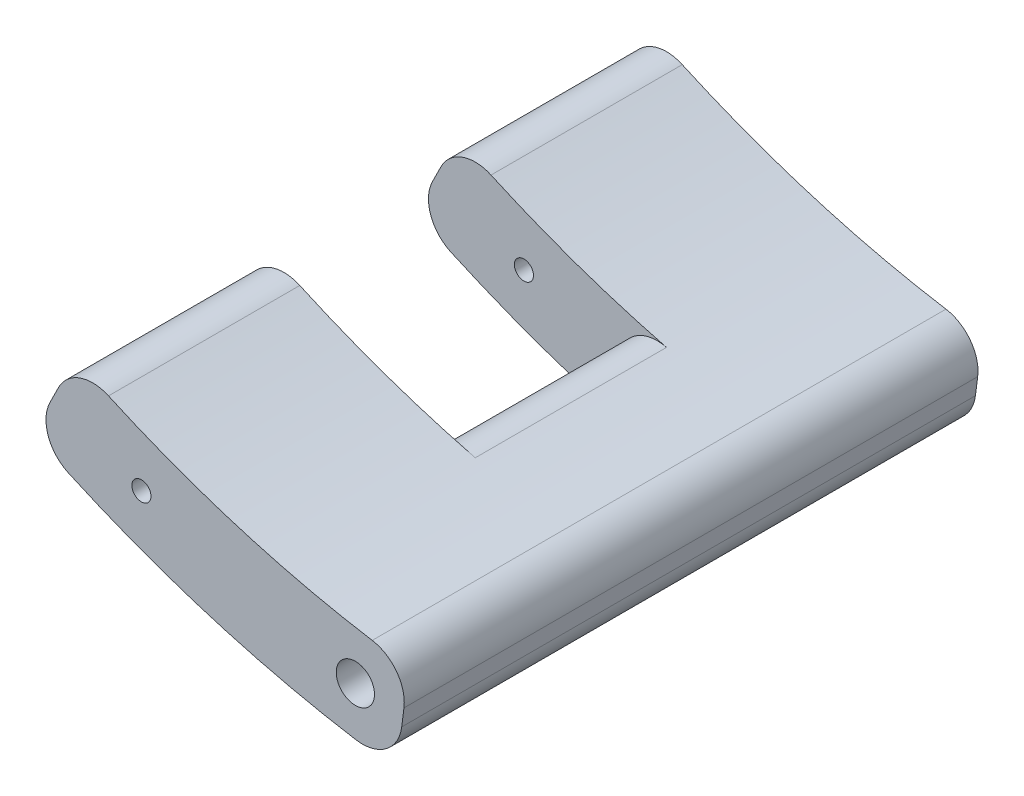
ISO-10303-21;
HEADER;
FILE_DESCRIPTION(('STEP AP214'),'2;1');
FILE_NAME('part.step','',(''),(''),'','','');
FILE_SCHEMA(('AUTOMOTIVE_DESIGN { 1 0 10303 214 1 1 1 1 }'));
ENDSEC;
DATA;
#1=APPLICATION_CONTEXT('core data for automotive mechanical design processes');
#2=APPLICATION_PROTOCOL_DEFINITION('international standard','automotive_design',2000,#1);
#3=PRODUCT_CONTEXT('',#1,'mechanical');
#4=PRODUCT('Part','Part','',(#3));
#5=PRODUCT_RELATED_PRODUCT_CATEGORY('part','',(#4));
#6=PRODUCT_DEFINITION_FORMATION('','',#4);
#7=PRODUCT_DEFINITION_CONTEXT('part definition',#1,'design');
#8=PRODUCT_DEFINITION('design','',#6,#7);
#9=PRODUCT_DEFINITION_SHAPE('','',#8);
#10=(LENGTH_UNIT() NAMED_UNIT(*) SI_UNIT(.MILLI.,.METRE.));
#11=(NAMED_UNIT(*) PLANE_ANGLE_UNIT() SI_UNIT($,.RADIAN.));
#12=(NAMED_UNIT(*) SI_UNIT($,.STERADIAN.) SOLID_ANGLE_UNIT());
#13=UNCERTAINTY_MEASURE_WITH_UNIT(LENGTH_MEASURE(1.E-05),#10,'distance_accuracy_value','');
#14=(GEOMETRIC_REPRESENTATION_CONTEXT(3) GLOBAL_UNCERTAINTY_ASSIGNED_CONTEXT((#13)) GLOBAL_UNIT_ASSIGNED_CONTEXT((#10,
#11,#12)) REPRESENTATION_CONTEXT('',''));
#15=CARTESIAN_POINT('',(0.,0.,0.));
#16=DIRECTION('',(0.,0.,1.));
#17=DIRECTION('',(1.,0.,0.));
#18=AXIS2_PLACEMENT_3D('',#15,#16,#17);
#19=CARTESIAN_POINT('',(6.63494892095158,-48.664048440519,58.49025));
#20=DIRECTION('',(-0.991854164428453,0.127378634416979,0.));
#21=DIRECTION('',(-0.127378634416979,-0.991854164428454,0.));
#22=AXIS2_PLACEMENT_3D('',#19,#20,#21);
#23=PLANE('',#22);
#24=DIRECTION('',(0.127378634416979,0.991854164428454,0.));
#25=VECTOR('',#24,1.);
#26=CARTESIAN_POINT('',(6.63494892095158,-48.664048440519,58.49025));
#27=LINE('',#26,#25);
#28=CARTESIAN_POINT('',(5.56629974651549,-56.9852566150994,58.49025));
#29=VERTEX_POINT('',#28);
#30=CARTESIAN_POINT('',(5.90928085405463,-54.314579217826,58.49025));
#31=VERTEX_POINT('',#30);
#32=EDGE_CURVE('E274',#29,#31,#27,.T.);
#33=ORIENTED_EDGE('',*,*,#32,.F.);
#34=DIRECTION('',(0.,0.,-1.));
#35=VECTOR('',#34,1.);
#36=CARTESIAN_POINT('',(5.56629974651549,-56.9852566150994,58.49025));
#37=LINE('',#36,#35);
#38=CARTESIAN_POINT('',(5.56629974651549,-56.9852566150994,-28.49025));
#39=VERTEX_POINT('',#38);
#40=EDGE_CURVE('E60',#29,#39,#37,.T.);
#41=ORIENTED_EDGE('',*,*,#40,.T.);
#42=DIRECTION('',(0.127378634416979,0.991854164428454,0.));
#43=VECTOR('',#42,1.);
#44=CARTESIAN_POINT('',(6.63494892095158,-48.664048440519,-28.49025));
#45=LINE('',#44,#43);
#46=CARTESIAN_POINT('',(5.90928085405463,-54.314579217826,-28.49025));
#47=VERTEX_POINT('',#46);
#48=EDGE_CURVE('E289',#39,#47,#45,.T.);
#49=ORIENTED_EDGE('',*,*,#48,.T.);
#50=DIRECTION('',(0.,0.,-1.));
#51=VECTOR('',#50,1.);
#52=CARTESIAN_POINT('',(5.90928085405463,-54.314579217826,58.49025));
#53=LINE('',#52,#51);
#54=EDGE_CURVE('E251',#47,#31,#53,.F.);
#55=ORIENTED_EDGE('',*,*,#54,.T.);
#56=EDGE_LOOP('',(#33,#41,#49,#55));
#57=FACE_BOUND('',#56,.T.);
#58=ADVANCED_FACE('F52',(#57),#23,.F.);
#59=CARTESIAN_POINT('',(26.9472873242794,109.501231999441,58.49025));
#60=DIRECTION('',(0.,0.,1.));
#61=DIRECTION('',(1.,0.,0.));
#62=AXIS2_PLACEMENT_3D('',#59,#60,#61);
#63=PLANE('',#62);
#64=CARTESIAN_POINT('',(-33.8907135144224,-45.7142214462155,58.49025));
#65=DIRECTION('',(0.,0.,1.));
#66=DIRECTION('',(1.,0.,0.));
#67=AXIS2_PLACEMENT_3D('',#64,#65,#66);
#68=CIRCLE('',#67,1.449675);
#69=CARTESIAN_POINT('',(-32.4410385144224,-45.7142214462155,58.49025));
#70=VERTEX_POINT('',#69);
#71=EDGE_CURVE('E332',#70,#70,#68,.T.);
#72=ORIENTED_EDGE('',*,*,#71,.F.);
#73=EDGE_LOOP('',(#72));
#74=FACE_BOUND('',#73,.T.);
#75=CARTESIAN_POINT('',(-1.45758914219094,-54.7737275266997,58.49025));
#76=DIRECTION('',(0.,0.,1.));
#77=DIRECTION('',(1.,0.,0.));
#78=AXIS2_PLACEMENT_3D('',#75,#76,#77);
#79=CIRCLE('',#78,2.89935000000001);
#80=CARTESIAN_POINT('',(1.44176085780907,-54.7737275266997,58.49025));
#81=VERTEX_POINT('',#80);
#82=EDGE_CURVE('E260',#81,#81,#79,.F.);
#83=ORIENTED_EDGE('',*,*,#82,.T.);
#84=EDGE_LOOP('',(#83));
#85=FACE_BOUND('',#84,.T.);
#86=CARTESIAN_POINT('',(26.9472873242794,109.501231999441,58.49025));
#87=DIRECTION('',(0.,0.,1.));
#88=DIRECTION('',(1.,0.,0.));
#89=AXIS2_PLACEMENT_3D('',#86,#87,#88);
#90=CIRCLE('',#89,173.961);
#91=CARTESIAN_POINT('',(-44.9597575797622,-48.9027023398555,58.49025));
#92=VERTEX_POINT('',#91);
#93=CARTESIAN_POINT('',(-1.36119877549505,-62.1410097003774,58.49025));
#94=VERTEX_POINT('',#93);
#95=EDGE_CURVE('E268',#92,#94,#90,.T.);
#96=ORIENTED_EDGE('',*,*,#95,.T.);
#97=CARTESIAN_POINT('',(-0.384825240055228,-56.2209848085975,58.49025));
#98=DIRECTION('',(0.,0.,1.));
#99=DIRECTION('',(1.,0.,0.));
#100=AXIS2_PLACEMENT_3D('',#97,#98,#99);
#101=CIRCLE('',#100,6.);
#102=EDGE_CURVE('E74',#94,#29,#101,.T.);
#103=ORIENTED_EDGE('',*,*,#102,.T.);
#104=ORIENTED_EDGE('',*,*,#32,.T.);
#105=CARTESIAN_POINT('',(0.157816110783354,-53.5759487304323,58.49025));
#106=DIRECTION('',(0.,0.,1.));
#107=DIRECTION('',(1.,0.,0.));
#108=AXIS2_PLACEMENT_3D('',#105,#106,#107);
#109=CIRCLE('',#108,5.7987);
#110=CARTESIAN_POINT('',(1.09779755687093,-47.8539423890333,58.49025));
#111=VERTEX_POINT('',#110);
#112=EDGE_CURVE('E254',#31,#111,#109,.T.);
#113=ORIENTED_EDGE('',*,*,#112,.T.);
#114=CARTESIAN_POINT('',(26.9472873242794,109.501231999441,58.49025));
#115=DIRECTION('',(0.,0.,-1.));
#116=DIRECTION('',(1.,0.,0.));
#117=AXIS2_PLACEMENT_3D('',#114,#115,#116);
#118=CIRCLE('',#117,159.46425);
#119=CARTESIAN_POINT('',(-38.8795960998077,-35.7422478773994,58.49025));
#120=VERTEX_POINT('',#119);
#121=EDGE_CURVE('E277',#111,#120,#118,.T.);
#122=ORIENTED_EDGE('',*,*,#121,.T.);
#123=CARTESIAN_POINT('',(-41.2733009515927,-41.02382896383,58.49025));
#124=DIRECTION('',(0.,0.,1.));
#125=DIRECTION('',(1.,0.,0.));
#126=AXIS2_PLACEMENT_3D('',#123,#124,#125);
#127=CIRCLE('',#126,5.7987);
#128=CARTESIAN_POINT('',(-46.4676401886901,-38.4462794337626,58.49025));
#129=VERTEX_POINT('',#128);
#130=EDGE_CURVE('E206',#120,#129,#127,.T.);
#131=ORIENTED_EDGE('',*,*,#130,.T.);
#132=DIRECTION('',(-0.444504721759584,-0.895776508027217,0.));
#133=VECTOR('',#132,1.);
#134=CARTESIAN_POINT('',(-43.9353247525714,-33.3430970207381,58.49025));
#135=LINE('',#134,#133);
#136=CARTESIAN_POINT('',(-47.7571953200582,-41.0450216651449,58.49025));
#137=VERTEX_POINT('',#136);
#138=EDGE_CURVE('E184',#129,#137,#135,.T.);
#139=ORIENTED_EDGE('',*,*,#138,.T.);
#140=CARTESIAN_POINT('',(-42.5628560829608,-43.6225711952122,58.49025));
#141=DIRECTION('',(0.,0.,1.));
#142=DIRECTION('',(1.,0.,0.));
#143=AXIS2_PLACEMENT_3D('',#140,#141,#142);
#144=CIRCLE('',#143,5.7987);
#145=EDGE_CURVE('E188',#137,#92,#144,.T.);
#146=ORIENTED_EDGE('',*,*,#145,.T.);
#147=EDGE_LOOP('',(#96,#103,#104,#113,#122,#131,#139,#146));
#148=FACE_BOUND('',#147,.T.);
#149=ADVANCED_FACE('F273',(#74,#85,#148),#63,.T.);
#150=CARTESIAN_POINT('',(26.9472873242794,109.501231999441,-28.49025));
#151=DIRECTION('',(0.,0.,1.));
#152=DIRECTION('',(1.,0.,0.));
#153=AXIS2_PLACEMENT_3D('',#150,#151,#152);
#154=PLANE('',#153);
#155=CARTESIAN_POINT('',(-33.8907135144224,-45.7142214462155,-28.49025));
#156=DIRECTION('',(0.,0.,1.));
#157=DIRECTION('',(1.,0.,0.));
#158=AXIS2_PLACEMENT_3D('',#155,#156,#157);
#159=CIRCLE('',#158,1.449675);
#160=CARTESIAN_POINT('',(-32.4410385144224,-45.7142214462155,-28.49025));
#161=VERTEX_POINT('',#160);
#162=EDGE_CURVE('E335',#161,#161,#159,.T.);
#163=ORIENTED_EDGE('',*,*,#162,.T.);
#164=EDGE_LOOP('',(#163));
#165=FACE_BOUND('',#164,.T.);
#166=CARTESIAN_POINT('',(-1.45758914219094,-54.7737275266997,-28.49025));
#167=DIRECTION('',(0.,0.,1.));
#168=DIRECTION('',(1.,0.,0.));
#169=AXIS2_PLACEMENT_3D('',#166,#167,#168);
#170=CIRCLE('',#169,2.89935000000001);
#171=CARTESIAN_POINT('',(1.44176085780907,-54.7737275266997,-28.49025));
#172=VERTEX_POINT('',#171);
#173=EDGE_CURVE('E257',#172,#172,#170,.F.);
#174=ORIENTED_EDGE('',*,*,#173,.F.);
#175=EDGE_LOOP('',(#174));
#176=FACE_BOUND('',#175,.T.);
#177=ORIENTED_EDGE('',*,*,#48,.F.);
#178=CARTESIAN_POINT('',(-0.384825240055228,-56.2209848085975,-28.49025));
#179=DIRECTION('',(0.,0.,1.));
#180=DIRECTION('',(1.,0.,0.));
#181=AXIS2_PLACEMENT_3D('',#178,#179,#180);
#182=CIRCLE('',#181,6.);
#183=CARTESIAN_POINT('',(-1.36119877549505,-62.1410097003774,-28.49025));
#184=VERTEX_POINT('',#183);
#185=EDGE_CURVE('E12',#39,#184,#182,.F.);
#186=ORIENTED_EDGE('',*,*,#185,.T.);
#187=CARTESIAN_POINT('',(26.9472873242794,109.501231999441,-28.49025));
#188=DIRECTION('',(0.,0.,1.));
#189=DIRECTION('',(1.,0.,0.));
#190=AXIS2_PLACEMENT_3D('',#187,#188,#189);
#191=CIRCLE('',#190,173.961);
#192=CARTESIAN_POINT('',(-44.9597575797622,-48.9027023398555,-28.49025));
#193=VERTEX_POINT('',#192);
#194=EDGE_CURVE('E270',#193,#184,#191,.T.);
#195=ORIENTED_EDGE('',*,*,#194,.F.);
#196=CARTESIAN_POINT('',(-42.5628560829608,-43.6225711952122,-28.49025));
#197=DIRECTION('',(0.,0.,1.));
#198=DIRECTION('',(1.,0.,0.));
#199=AXIS2_PLACEMENT_3D('',#196,#197,#198);
#200=CIRCLE('',#199,5.7987);
#201=CARTESIAN_POINT('',(-47.7571953200582,-41.0450216651449,-28.49025));
#202=VERTEX_POINT('',#201);
#203=EDGE_CURVE('E221',#193,#202,#200,.F.);
#204=ORIENTED_EDGE('',*,*,#203,.T.);
#205=DIRECTION('',(-0.444504721759584,-0.895776508027217,0.));
#206=VECTOR('',#205,1.);
#207=CARTESIAN_POINT('',(-43.9353247525714,-33.3430970207381,-28.49025));
#208=LINE('',#207,#206);
#209=CARTESIAN_POINT('',(-46.4676401886901,-38.4462794337626,-28.49025));
#210=VERTEX_POINT('',#209);
#211=EDGE_CURVE('E275',#210,#202,#208,.T.);
#212=ORIENTED_EDGE('',*,*,#211,.F.);
#213=CARTESIAN_POINT('',(-41.2733009515927,-41.02382896383,-28.49025));
#214=DIRECTION('',(0.,0.,1.));
#215=DIRECTION('',(1.,0.,0.));
#216=AXIS2_PLACEMENT_3D('',#213,#214,#215);
#217=CIRCLE('',#216,5.7987);
#218=CARTESIAN_POINT('',(-38.8795960998077,-35.7422478773994,-28.49025));
#219=VERTEX_POINT('',#218);
#220=EDGE_CURVE('E223',#210,#219,#217,.F.);
#221=ORIENTED_EDGE('',*,*,#220,.T.);
#222=CARTESIAN_POINT('',(26.9472873242794,109.501231999441,-28.49025));
#223=DIRECTION('',(0.,0.,-1.));
#224=DIRECTION('',(1.,0.,0.));
#225=AXIS2_PLACEMENT_3D('',#222,#223,#224);
#226=CIRCLE('',#225,159.46425);
#227=CARTESIAN_POINT('',(1.09779755687093,-47.8539423890333,-28.49025));
#228=VERTEX_POINT('',#227);
#229=EDGE_CURVE('E280',#228,#219,#226,.T.);
#230=ORIENTED_EDGE('',*,*,#229,.F.);
#231=CARTESIAN_POINT('',(0.157816110783354,-53.5759487304323,-28.49025));
#232=DIRECTION('',(0.,0.,1.));
#233=DIRECTION('',(1.,0.,0.));
#234=AXIS2_PLACEMENT_3D('',#231,#232,#233);
#235=CIRCLE('',#234,5.7987);
#236=EDGE_CURVE('E248',#228,#47,#235,.F.);
#237=ORIENTED_EDGE('',*,*,#236,.T.);
#238=EDGE_LOOP('',(#177,#186,#195,#204,#212,#221,#230,#237));
#239=FACE_BOUND('',#238,.T.);
#240=ADVANCED_FACE('F300',(#165,#176,#239),#154,.F.);
#241=CARTESIAN_POINT('',(26.9472873242794,109.501231999441,58.49025));
#242=DIRECTION('',(0.,0.,-1.));
#243=DIRECTION('',(-1.,0.,0.));
#244=AXIS2_PLACEMENT_3D('',#241,#242,#243);
#245=CYLINDRICAL_SURFACE('',#244,173.961);
#246=ORIENTED_EDGE('',*,*,#194,.T.);
#247=DIRECTION('',(0.,0.,-1.));
#248=VECTOR('',#247,1.);
#249=CARTESIAN_POINT('',(-1.36119877549505,-62.1410097003774,58.49025));
#250=LINE('',#249,#248);
#251=EDGE_CURVE('E256',#184,#94,#250,.F.);
#252=ORIENTED_EDGE('',*,*,#251,.T.);
#253=ORIENTED_EDGE('',*,*,#95,.F.);
#254=DIRECTION('',(0.,0.,-1.));
#255=VECTOR('',#254,1.);
#256=CARTESIAN_POINT('',(-44.9597575797622,-48.9027023398555,58.49025));
#257=LINE('',#256,#255);
#258=CARTESIAN_POINT('',(-44.9597575797622,-48.9027023398555,29.49675));
#259=VERTEX_POINT('',#258);
#260=EDGE_CURVE('E214',#92,#259,#257,.T.);
#261=ORIENTED_EDGE('',*,*,#260,.T.);
#262=CARTESIAN_POINT('',(26.9472873242794,109.501231999441,29.49675));
#263=DIRECTION('',(0.,0.,-1.));
#264=DIRECTION('',(-1.,0.,0.));
#265=AXIS2_PLACEMENT_3D('',#262,#263,#264);
#266=CIRCLE('',#265,173.961);
#267=CARTESIAN_POINT('',(-16.4653455528447,-58.9558035546612,29.49675));
#268=VERTEX_POINT('',#267);
#269=EDGE_CURVE('E168',#268,#259,#266,.T.);
#270=ORIENTED_EDGE('',*,*,#269,.F.);
#271=DIRECTION('',(0.,0.,-1.));
#272=VECTOR('',#271,1.);
#273=CARTESIAN_POINT('',(-16.4653455528447,-58.9558035546612,58.49025));
#274=LINE('',#273,#272);
#275=CARTESIAN_POINT('',(-16.4653455528447,-58.9558035546612,0.503249999999996));
#276=VERTEX_POINT('',#275);
#277=EDGE_CURVE('E208',#268,#276,#274,.T.);
#278=ORIENTED_EDGE('',*,*,#277,.T.);
#279=CARTESIAN_POINT('',(26.9472873242794,109.501231999441,0.50325));
#280=DIRECTION('',(0.,0.,-1.));
#281=DIRECTION('',(-1.,0.,0.));
#282=AXIS2_PLACEMENT_3D('',#279,#280,#281);
#283=CIRCLE('',#282,173.961);
#284=CARTESIAN_POINT('',(-44.9597575797622,-48.9027023398555,0.50325));
#285=VERTEX_POINT('',#284);
#286=EDGE_CURVE('E283',#276,#285,#283,.T.);
#287=ORIENTED_EDGE('',*,*,#286,.T.);
#288=DIRECTION('',(0.,0.,-1.));
#289=VECTOR('',#288,1.);
#290=CARTESIAN_POINT('',(-44.9597575797622,-48.9027023398555,58.49025));
#291=LINE('',#290,#289);
#292=EDGE_CURVE('E211',#285,#193,#291,.T.);
#293=ORIENTED_EDGE('',*,*,#292,.T.);
#294=EDGE_LOOP('',(#246,#252,#253,#261,#270,#278,#287,#293));
#295=FACE_BOUND('',#294,.T.);
#296=ADVANCED_FACE('F267',(#295),#245,.T.);
#297=CARTESIAN_POINT('',(-43.9353247525714,-33.3430970207381,58.49025));
#298=DIRECTION('',(0.895776508027217,-0.444504721759584,0.));
#299=DIRECTION('',(0.444504721759584,0.895776508027217,0.));
#300=AXIS2_PLACEMENT_3D('',#297,#298,#299);
#301=PLANE('',#300);
#302=ORIENTED_EDGE('',*,*,#138,.F.);
#303=DIRECTION('',(0.,0.,-1.));
#304=VECTOR('',#303,1.);
#305=CARTESIAN_POINT('',(-46.4676401886901,-38.4462794337626,58.49025));
#306=LINE('',#305,#304);
#307=CARTESIAN_POINT('',(-46.4676401886901,-38.4462794337626,29.49675));
#308=VERTEX_POINT('',#307);
#309=EDGE_CURVE('E174',#129,#308,#306,.T.);
#310=ORIENTED_EDGE('',*,*,#309,.T.);
#311=DIRECTION('',(0.444504721759584,0.895776508027217,0.));
#312=VECTOR('',#311,1.);
#313=CARTESIAN_POINT('',(-43.9353247525714,-33.3430970207381,29.49675));
#314=LINE('',#313,#312);
#315=CARTESIAN_POINT('',(-47.7571953200582,-41.0450216651449,29.49675));
#316=VERTEX_POINT('',#315);
#317=EDGE_CURVE('E166',#316,#308,#314,.T.);
#318=ORIENTED_EDGE('',*,*,#317,.F.);
#319=DIRECTION('',(0.,0.,-1.));
#320=VECTOR('',#319,1.);
#321=CARTESIAN_POINT('',(-47.7571953200582,-41.0450216651449,58.49025));
#322=LINE('',#321,#320);
#323=EDGE_CURVE('E180',#316,#137,#322,.F.);
#324=ORIENTED_EDGE('',*,*,#323,.T.);
#325=EDGE_LOOP('',(#302,#310,#318,#324));
#326=FACE_BOUND('',#325,.T.);
#327=ADVANCED_FACE('F179',(#326),#301,.F.);
#328=CARTESIAN_POINT('',(26.9472873242794,109.501231999441,58.49025));
#329=DIRECTION('',(0.,0.,-1.));
#330=DIRECTION('',(-1.,0.,0.));
#331=AXIS2_PLACEMENT_3D('',#328,#329,#330);
#332=CYLINDRICAL_SURFACE('',#331,159.46425);
#333=ORIENTED_EDGE('',*,*,#121,.F.);
#334=DIRECTION('',(0.,0.,-1.));
#335=VECTOR('',#334,1.);
#336=CARTESIAN_POINT('',(1.09779755687092,-47.8539423890333,58.49025));
#337=LINE('',#336,#335);
#338=EDGE_CURVE('E245',#111,#228,#337,.T.);
#339=ORIENTED_EDGE('',*,*,#338,.T.);
#340=ORIENTED_EDGE('',*,*,#229,.T.);
#341=DIRECTION('',(0.,0.,-1.));
#342=VECTOR('',#341,1.);
#343=CARTESIAN_POINT('',(-38.8795960998077,-35.7422478773994,58.49025));
#344=LINE('',#343,#342);
#345=CARTESIAN_POINT('',(-38.8795960998077,-35.7422478773994,0.50325));
#346=VERTEX_POINT('',#345);
#347=EDGE_CURVE('E200',#219,#346,#344,.F.);
#348=ORIENTED_EDGE('',*,*,#347,.T.);
#349=CARTESIAN_POINT('',(26.9472873242794,109.501231999441,0.50325));
#350=DIRECTION('',(0.,0.,-1.));
#351=DIRECTION('',(-1.,0.,0.));
#352=AXIS2_PLACEMENT_3D('',#349,#350,#351);
#353=CIRCLE('',#352,159.46425);
#354=CARTESIAN_POINT('',(-12.2742268394259,-45.064352315984,0.503249999999996));
#355=VERTEX_POINT('',#354);
#356=EDGE_CURVE('E309',#346,#355,#353,.F.);
#357=ORIENTED_EDGE('',*,*,#356,.T.);
#358=DIRECTION('',(0.,0.,-1.));
#359=VECTOR('',#358,1.);
#360=CARTESIAN_POINT('',(-12.2742268394259,-45.0643523159841,58.49025));
#361=LINE('',#360,#359);
#362=CARTESIAN_POINT('',(-12.2742268394259,-45.064352315984,29.49675));
#363=VERTEX_POINT('',#362);
#364=EDGE_CURVE('E197',#355,#363,#361,.F.);
#365=ORIENTED_EDGE('',*,*,#364,.T.);
#366=CARTESIAN_POINT('',(26.9472873242794,109.501231999441,29.49675));
#367=DIRECTION('',(0.,0.,-1.));
#368=DIRECTION('',(-1.,0.,0.));
#369=AXIS2_PLACEMENT_3D('',#366,#367,#368);
#370=CIRCLE('',#369,159.46425);
#371=CARTESIAN_POINT('',(-38.8795960998077,-35.7422478773994,29.49675));
#372=VERTEX_POINT('',#371);
#373=EDGE_CURVE('E319',#372,#363,#370,.F.);
#374=ORIENTED_EDGE('',*,*,#373,.F.);
#375=DIRECTION('',(0.,0.,-1.));
#376=VECTOR('',#375,1.);
#377=CARTESIAN_POINT('',(-38.8795960998077,-35.7422478773994,58.49025));
#378=LINE('',#377,#376);
#379=EDGE_CURVE('E202',#372,#120,#378,.F.);
#380=ORIENTED_EDGE('',*,*,#379,.T.);
#381=EDGE_LOOP('',(#333,#339,#340,#348,#357,#365,#374,#380));
#382=FACE_BOUND('',#381,.T.);
#383=ADVANCED_FACE('F294',(#382),#332,.F.);
#384=DIRECTION('',(0.444504721759584,0.895776508027217,0.));
#385=VECTOR('',#384,1.);
#386=CARTESIAN_POINT('',(-43.9353247525714,-33.3430970207381,0.50325));
#387=LINE('',#386,#385);
#388=CARTESIAN_POINT('',(-47.7571953200582,-41.0450216651449,0.50325));
#389=VERTEX_POINT('',#388);
#390=CARTESIAN_POINT('',(-46.4676401886901,-38.4462794337626,0.50325));
#391=VERTEX_POINT('',#390);
#392=EDGE_CURVE('E183',#389,#391,#387,.T.);
#393=ORIENTED_EDGE('',*,*,#392,.T.);
#394=DIRECTION('',(0.,0.,-1.));
#395=VECTOR('',#394,1.);
#396=CARTESIAN_POINT('',(-46.4676401886901,-38.4462794337626,58.49025));
#397=LINE('',#396,#395);
#398=EDGE_CURVE('E218',#391,#210,#397,.T.);
#399=ORIENTED_EDGE('',*,*,#398,.T.);
#400=ORIENTED_EDGE('',*,*,#211,.T.);
#401=DIRECTION('',(0.,0.,-1.));
#402=VECTOR('',#401,1.);
#403=CARTESIAN_POINT('',(-47.7571953200582,-41.0450216651449,58.49025));
#404=LINE('',#403,#402);
#405=EDGE_CURVE('E216',#202,#389,#404,.F.);
#406=ORIENTED_EDGE('',*,*,#405,.T.);
#407=EDGE_LOOP('',(#393,#399,#400,#406));
#408=FACE_BOUND('',#407,.T.);
#409=ADVANCED_FACE('F311',(#408),#301,.F.);
#410=CARTESIAN_POINT('',(-7.97172897495413,-26.0949305017808,29.49675));
#411=DIRECTION('',(-0.895776508027217,0.444504721759584,0.));
#412=DIRECTION('',(-0.444504721759584,-0.895776508027217,0.));
#413=AXIS2_PLACEMENT_3D('',#410,#411,#412);
#414=PLANE('',#413);
#415=DIRECTION('',(-0.444504721759584,-0.895776508027217,0.));
#416=VECTOR('',#415,1.);
#417=CARTESIAN_POINT('',(-7.97172897495413,-26.0949305017808,29.49675));
#418=LINE('',#417,#416);
#419=CARTESIAN_POINT('',(-18.8948029552035,-48.1073694882958,29.49675));
#420=VERTEX_POINT('',#419);
#421=CARTESIAN_POINT('',(-20.2125970273713,-50.7630195061238,29.49675));
#422=VERTEX_POINT('',#421);
#423=EDGE_CURVE('E326',#420,#422,#418,.T.);
#424=ORIENTED_EDGE('',*,*,#423,.F.);
#425=DIRECTION('',(0.,0.,1.));
#426=VECTOR('',#425,1.);
#427=CARTESIAN_POINT('',(-18.8948029552035,-48.1073694882958,0.503249999999991));
#428=LINE('',#427,#426);
#429=CARTESIAN_POINT('',(-18.8948029552035,-48.1073694882958,0.503249999999991));
#430=VERTEX_POINT('',#429);
#431=EDGE_CURVE('E233',#420,#430,#428,.F.);
#432=ORIENTED_EDGE('',*,*,#431,.T.);
#433=DIRECTION('',(-0.444504721759584,-0.895776508027217,0.));
#434=VECTOR('',#433,1.);
#435=CARTESIAN_POINT('',(-7.97172897495414,-26.0949305017808,0.503249999999991));
#436=LINE('',#435,#434);
#437=CARTESIAN_POINT('',(-20.2125970273713,-50.7630195061238,0.503249999999991));
#438=VERTEX_POINT('',#437);
#439=EDGE_CURVE('E323',#430,#438,#436,.T.);
#440=ORIENTED_EDGE('',*,*,#439,.T.);
#441=DIRECTION('',(0.,0.,1.));
#442=VECTOR('',#441,1.);
#443=CARTESIAN_POINT('',(-20.2125970273713,-50.7630195061238,29.49675));
#444=LINE('',#443,#442);
#445=EDGE_CURVE('E230',#438,#422,#444,.T.);
#446=ORIENTED_EDGE('',*,*,#445,.T.);
#447=EDGE_LOOP('',(#424,#432,#440,#446));
#448=FACE_BOUND('',#447,.T.);
#449=ADVANCED_FACE('F399',(#448),#414,.T.);
#450=CARTESIAN_POINT('',(-33.9434251604413,-13.2071828514442,0.503249999999996));
#451=DIRECTION('',(0.,0.,-1.));
#452=DIRECTION('',(-1.,0.,0.));
#453=AXIS2_PLACEMENT_3D('',#450,#451,#452);
#454=PLANE('',#453);
#455=CARTESIAN_POINT('',(-33.8907135144224,-45.7142214462155,0.503249999999996));
#456=DIRECTION('',(0.,0.,-1.));
#457=DIRECTION('',(-1.,0.,0.));
#458=AXIS2_PLACEMENT_3D('',#455,#456,#457);
#459=CIRCLE('',#458,1.449675);
#460=CARTESIAN_POINT('',(-35.3403885144224,-45.7142214462155,0.503249999999996));
#461=VERTEX_POINT('',#460);
#462=EDGE_CURVE('E329',#461,#461,#459,.T.);
#463=ORIENTED_EDGE('',*,*,#462,.T.);
#464=EDGE_LOOP('',(#463));
#465=FACE_BOUND('',#464,.T.);
#466=ORIENTED_EDGE('',*,*,#356,.F.);
#467=CARTESIAN_POINT('',(-41.2733009515927,-41.02382896383,0.50325));
#468=DIRECTION('',(0.,0.,-1.));
#469=DIRECTION('',(-1.,0.,0.));
#470=AXIS2_PLACEMENT_3D('',#467,#468,#469);
#471=CIRCLE('',#470,5.7987);
#472=EDGE_CURVE('E228',#346,#391,#471,.F.);
#473=ORIENTED_EDGE('',*,*,#472,.T.);
#474=ORIENTED_EDGE('',*,*,#392,.F.);
#475=CARTESIAN_POINT('',(-42.5628560829608,-43.6225711952122,0.50325));
#476=DIRECTION('',(0.,0.,-1.));
#477=DIRECTION('',(-1.,0.,0.));
#478=AXIS2_PLACEMENT_3D('',#475,#476,#477);
#479=CIRCLE('',#478,5.7987);
#480=EDGE_CURVE('E226',#389,#285,#479,.F.);
#481=ORIENTED_EDGE('',*,*,#480,.T.);
#482=ORIENTED_EDGE('',*,*,#286,.F.);
#483=CARTESIAN_POINT('',(-15.0182577902739,-53.3405690361911,0.50324999999998));
#484=DIRECTION('',(0.,0.,-1.));
#485=DIRECTION('',(-1.,0.,0.));
#486=AXIS2_PLACEMENT_3D('',#483,#484,#485);
#487=CIRCLE('',#486,5.7987);
#488=EDGE_CURVE('E243',#276,#438,#487,.T.);
#489=ORIENTED_EDGE('',*,*,#488,.T.);
#490=ORIENTED_EDGE('',*,*,#439,.F.);
#491=CARTESIAN_POINT('',(-13.7004637181061,-50.6849190183631,0.50324999999998));
#492=DIRECTION('',(0.,0.,-1.));
#493=DIRECTION('',(-1.,0.,0.));
#494=AXIS2_PLACEMENT_3D('',#491,#492,#493);
#495=CIRCLE('',#494,5.7987);
#496=EDGE_CURVE('E236',#430,#355,#495,.T.);
#497=ORIENTED_EDGE('',*,*,#496,.T.);
#498=EDGE_LOOP('',(#466,#473,#474,#481,#482,#489,#490,#497));
#499=FACE_BOUND('',#498,.T.);
#500=ADVANCED_FACE('F307',(#465,#499),#454,.F.);
#501=CARTESIAN_POINT('',(-33.9434251604413,-13.2071828514442,29.49675));
#502=DIRECTION('',(0.,0.,-1.));
#503=DIRECTION('',(-1.,0.,0.));
#504=AXIS2_PLACEMENT_3D('',#501,#502,#503);
#505=PLANE('',#504);
#506=CARTESIAN_POINT('',(-33.8907135144224,-45.7142214462155,29.49675));
#507=DIRECTION('',(0.,0.,-1.));
#508=DIRECTION('',(-1.,0.,0.));
#509=AXIS2_PLACEMENT_3D('',#506,#507,#508);
#510=CIRCLE('',#509,1.449675);
#511=CARTESIAN_POINT('',(-35.3403885144224,-45.7142214462155,29.49675));
#512=VERTEX_POINT('',#511);
#513=EDGE_CURVE('E194',#512,#512,#510,.T.);
#514=ORIENTED_EDGE('',*,*,#513,.F.);
#515=EDGE_LOOP('',(#514));
#516=FACE_BOUND('',#515,.T.);
#517=ORIENTED_EDGE('',*,*,#317,.T.);
#518=CARTESIAN_POINT('',(-41.2733009515927,-41.02382896383,29.49675));
#519=DIRECTION('',(0.,0.,-1.));
#520=DIRECTION('',(-1.,0.,0.));
#521=AXIS2_PLACEMENT_3D('',#518,#519,#520);
#522=CIRCLE('',#521,5.7987);
#523=EDGE_CURVE('E173',#308,#372,#522,.T.);
#524=ORIENTED_EDGE('',*,*,#523,.T.);
#525=ORIENTED_EDGE('',*,*,#373,.T.);
#526=CARTESIAN_POINT('',(-13.7004637181061,-50.6849190183631,29.49675));
#527=DIRECTION('',(0.,0.,-1.));
#528=DIRECTION('',(-1.,0.,0.));
#529=AXIS2_PLACEMENT_3D('',#526,#527,#528);
#530=CIRCLE('',#529,5.7987);
#531=EDGE_CURVE('E239',#363,#420,#530,.F.);
#532=ORIENTED_EDGE('',*,*,#531,.T.);
#533=ORIENTED_EDGE('',*,*,#423,.T.);
#534=CARTESIAN_POINT('',(-15.0182577902739,-53.3405690361911,29.49675));
#535=DIRECTION('',(0.,0.,-1.));
#536=DIRECTION('',(-1.,0.,0.));
#537=AXIS2_PLACEMENT_3D('',#534,#535,#536);
#538=CIRCLE('',#537,5.7987);
#539=EDGE_CURVE('E241',#422,#268,#538,.F.);
#540=ORIENTED_EDGE('',*,*,#539,.T.);
#541=ORIENTED_EDGE('',*,*,#269,.T.);
#542=CARTESIAN_POINT('',(-42.5628560829608,-43.6225711952122,29.49675));
#543=DIRECTION('',(0.,0.,-1.));
#544=DIRECTION('',(-1.,0.,0.));
#545=AXIS2_PLACEMENT_3D('',#542,#543,#544);
#546=CIRCLE('',#545,5.7987);
#547=EDGE_CURVE('E163',#259,#316,#546,.T.);
#548=ORIENTED_EDGE('',*,*,#547,.T.);
#549=EDGE_LOOP('',(#517,#524,#525,#532,#533,#540,#541,#548));
#550=FACE_BOUND('',#549,.T.);
#551=ADVANCED_FACE('F165',(#516,#550),#505,.T.);
#552=CARTESIAN_POINT('',(-33.8907135144224,-45.7142214462155,-28.49025));
#553=DIRECTION('',(0.,0.,1.));
#554=DIRECTION('',(1.,0.,0.));
#555=AXIS2_PLACEMENT_3D('',#552,#553,#554);
#556=CYLINDRICAL_SURFACE('',#555,1.449675);
#557=ORIENTED_EDGE('',*,*,#513,.T.);
#558=EDGE_LOOP('',(#557));
#559=FACE_BOUND('',#558,.T.);
#560=ORIENTED_EDGE('',*,*,#71,.T.);
#561=EDGE_LOOP('',(#560));
#562=FACE_BOUND('',#561,.T.);
#563=ADVANCED_FACE('F412',(#559,#562),#556,.F.);
#564=ORIENTED_EDGE('',*,*,#162,.F.);
#565=EDGE_LOOP('',(#564));
#566=FACE_BOUND('',#565,.T.);
#567=ORIENTED_EDGE('',*,*,#462,.F.);
#568=EDGE_LOOP('',(#567));
#569=FACE_BOUND('',#568,.T.);
#570=ADVANCED_FACE('F369',(#566,#569),#556,.F.);
#571=CARTESIAN_POINT('',(-41.2733009515927,-41.02382896383,58.49025));
#572=DIRECTION('',(0.,0.,-1.));
#573=DIRECTION('',(-1.,0.,0.));
#574=AXIS2_PLACEMENT_3D('',#571,#572,#573);
#575=CYLINDRICAL_SURFACE('',#574,5.7987);
#576=ORIENTED_EDGE('',*,*,#130,.F.);
#577=ORIENTED_EDGE('',*,*,#379,.F.);
#578=ORIENTED_EDGE('',*,*,#523,.F.);
#579=ORIENTED_EDGE('',*,*,#309,.F.);
#580=EDGE_LOOP('',(#576,#577,#578,#579));
#581=FACE_BOUND('',#580,.T.);
#582=ADVANCED_FACE('F366',(#581),#575,.T.);
#583=CARTESIAN_POINT('',(-42.5628560829608,-43.6225711952122,58.49025));
#584=DIRECTION('',(0.,0.,-1.));
#585=DIRECTION('',(-1.,0.,0.));
#586=AXIS2_PLACEMENT_3D('',#583,#584,#585);
#587=CYLINDRICAL_SURFACE('',#586,5.7987);
#588=ORIENTED_EDGE('',*,*,#145,.F.);
#589=ORIENTED_EDGE('',*,*,#323,.F.);
#590=ORIENTED_EDGE('',*,*,#547,.F.);
#591=ORIENTED_EDGE('',*,*,#260,.F.);
#592=EDGE_LOOP('',(#588,#589,#590,#591));
#593=FACE_BOUND('',#592,.T.);
#594=ADVANCED_FACE('F187',(#593),#587,.T.);
#595=CARTESIAN_POINT('',(-41.2733009515927,-41.02382896383,58.49025));
#596=DIRECTION('',(0.,0.,-1.));
#597=DIRECTION('',(-1.,0.,0.));
#598=AXIS2_PLACEMENT_3D('',#595,#596,#597);
#599=CYLINDRICAL_SURFACE('',#598,5.7987);
#600=ORIENTED_EDGE('',*,*,#472,.F.);
#601=ORIENTED_EDGE('',*,*,#347,.F.);
#602=ORIENTED_EDGE('',*,*,#220,.F.);
#603=ORIENTED_EDGE('',*,*,#398,.F.);
#604=EDGE_LOOP('',(#600,#601,#602,#603));
#605=FACE_BOUND('',#604,.T.);
#606=ADVANCED_FACE('F304',(#605),#599,.T.);
#607=CARTESIAN_POINT('',(-42.5628560829608,-43.6225711952122,58.49025));
#608=DIRECTION('',(0.,0.,-1.));
#609=DIRECTION('',(-1.,0.,0.));
#610=AXIS2_PLACEMENT_3D('',#607,#608,#609);
#611=CYLINDRICAL_SURFACE('',#610,5.7987);
#612=ORIENTED_EDGE('',*,*,#480,.F.);
#613=ORIENTED_EDGE('',*,*,#405,.F.);
#614=ORIENTED_EDGE('',*,*,#203,.F.);
#615=ORIENTED_EDGE('',*,*,#292,.F.);
#616=EDGE_LOOP('',(#612,#613,#614,#615));
#617=FACE_BOUND('',#616,.T.);
#618=ADVANCED_FACE('F314',(#617),#611,.T.);
#619=CARTESIAN_POINT('',(-13.7004637181061,-50.6849190183631,58.49025));
#620=DIRECTION('',(0.,0.,-1.));
#621=DIRECTION('',(-1.,0.,0.));
#622=AXIS2_PLACEMENT_3D('',#619,#620,#621);
#623=CYLINDRICAL_SURFACE('',#622,5.7987);
#624=ORIENTED_EDGE('',*,*,#531,.F.);
#625=ORIENTED_EDGE('',*,*,#364,.F.);
#626=ORIENTED_EDGE('',*,*,#496,.F.);
#627=ORIENTED_EDGE('',*,*,#431,.F.);
#628=EDGE_LOOP('',(#624,#625,#626,#627));
#629=FACE_BOUND('',#628,.T.);
#630=ADVANCED_FACE('F377',(#629),#623,.T.);
#631=CARTESIAN_POINT('',(-15.0182577902739,-53.3405690361911,58.49025));
#632=DIRECTION('',(0.,0.,-1.));
#633=DIRECTION('',(-1.,0.,0.));
#634=AXIS2_PLACEMENT_3D('',#631,#632,#633);
#635=CYLINDRICAL_SURFACE('',#634,5.7987);
#636=ORIENTED_EDGE('',*,*,#488,.F.);
#637=ORIENTED_EDGE('',*,*,#277,.F.);
#638=ORIENTED_EDGE('',*,*,#539,.F.);
#639=ORIENTED_EDGE('',*,*,#445,.F.);
#640=EDGE_LOOP('',(#636,#637,#638,#639));
#641=FACE_BOUND('',#640,.T.);
#642=ADVANCED_FACE('F380',(#641),#635,.T.);
#643=CARTESIAN_POINT('',(0.157816110783354,-53.5759487304323,58.49025));
#644=DIRECTION('',(0.,0.,-1.));
#645=DIRECTION('',(-1.,0.,0.));
#646=AXIS2_PLACEMENT_3D('',#643,#644,#645);
#647=CYLINDRICAL_SURFACE('',#646,5.7987);
#648=ORIENTED_EDGE('',*,*,#112,.F.);
#649=ORIENTED_EDGE('',*,*,#54,.F.);
#650=ORIENTED_EDGE('',*,*,#236,.F.);
#651=ORIENTED_EDGE('',*,*,#338,.F.);
#652=EDGE_LOOP('',(#648,#649,#650,#651));
#653=FACE_BOUND('',#652,.T.);
#654=ADVANCED_FACE('F345',(#653),#647,.T.);
#655=CARTESIAN_POINT('',(-1.45758914219094,-54.7737275266997,-28.4902847922));
#656=DIRECTION('',(0.,0.,1.));
#657=DIRECTION('',(1.,0.,0.));
#658=AXIS2_PLACEMENT_3D('',#655,#656,#657);
#659=CYLINDRICAL_SURFACE('',#658,2.89935000000001);
#660=CARTESIAN_POINT('',(1.44176085780907,-54.7737275266997,58.49025));
#661=CARTESIAN_POINT('',(1.44176085780907,-54.7737275266997,57.584203125));
#662=CARTESIAN_POINT('',(1.44176085780907,-54.7737275266997,56.67815625));
#663=CARTESIAN_POINT('',(1.44176085780907,-54.7737275266997,54.8660625));
#664=CARTESIAN_POINT('',(1.44176085780907,-54.7737275266997,53.960015625));
#665=CARTESIAN_POINT('',(1.44176085780907,-54.7737275266997,52.147921875));
#666=CARTESIAN_POINT('',(1.44176085780907,-54.7737275266997,51.241875));
#667=CARTESIAN_POINT('',(1.44176085780907,-54.7737275266997,49.42978125));
#668=CARTESIAN_POINT('',(1.44176085780907,-54.7737275266997,48.523734375));
#669=CARTESIAN_POINT('',(1.44176085780907,-54.7737275266997,46.711640625));
#670=CARTESIAN_POINT('',(1.44176085780907,-54.7737275266997,45.80559375));
#671=CARTESIAN_POINT('',(1.44176085780907,-54.7737275266997,43.9935));
#672=CARTESIAN_POINT('',(1.44176085780907,-54.7737275266997,43.087453125));
#673=CARTESIAN_POINT('',(1.44176085780907,-54.7737275266997,41.275359375));
#674=CARTESIAN_POINT('',(1.44176085780907,-54.7737275266997,40.3693125));
#675=CARTESIAN_POINT('',(1.44176085780907,-54.7737275266997,38.55721875));
#676=CARTESIAN_POINT('',(1.44176085780907,-54.7737275266997,37.651171875));
#677=CARTESIAN_POINT('',(1.44176085780907,-54.7737275266997,35.839078125));
#678=CARTESIAN_POINT('',(1.44176085780907,-54.7737275266997,34.93303125));
#679=CARTESIAN_POINT('',(1.44176085780907,-54.7737275266997,33.1209375));
#680=CARTESIAN_POINT('',(1.44176085780907,-54.7737275266997,32.214890625));
#681=CARTESIAN_POINT('',(1.44176085780907,-54.7737275266997,30.402796875));
#682=CARTESIAN_POINT('',(1.44176085780907,-54.7737275266997,29.49675));
#683=CARTESIAN_POINT('',(1.44176085780907,-54.7737275266997,27.68465625));
#684=CARTESIAN_POINT('',(1.44176085780907,-54.7737275266997,26.778609375));
#685=CARTESIAN_POINT('',(1.44176085780907,-54.7737275266997,24.966515625));
#686=CARTESIAN_POINT('',(1.44176085780907,-54.7737275266997,24.06046875));
#687=CARTESIAN_POINT('',(1.44176085780907,-54.7737275266997,22.248375));
#688=CARTESIAN_POINT('',(1.44176085780907,-54.7737275266997,21.342328125));
#689=CARTESIAN_POINT('',(1.44176085780907,-54.7737275266997,19.530234375));
#690=CARTESIAN_POINT('',(1.44176085780907,-54.7737275266997,18.6241875));
#691=CARTESIAN_POINT('',(1.44176085780907,-54.7737275266997,16.81209375));
#692=CARTESIAN_POINT('',(1.44176085780907,-54.7737275266997,15.906046875));
#693=CARTESIAN_POINT('',(1.44176085780907,-54.7737275266997,14.093953125));
#694=CARTESIAN_POINT('',(1.44176085780907,-54.7737275266997,13.18790625));
#695=CARTESIAN_POINT('',(1.44176085780907,-54.7737275266997,11.3758125));
#696=CARTESIAN_POINT('',(1.44176085780907,-54.7737275266997,10.469765625));
#697=CARTESIAN_POINT('',(1.44176085780907,-54.7737275266997,8.65767187499999));
#698=CARTESIAN_POINT('',(1.44176085780907,-54.7737275266997,7.75162499999999));
#699=CARTESIAN_POINT('',(1.44176085780907,-54.7737275266997,5.93953124999999));
#700=CARTESIAN_POINT('',(1.44176085780907,-54.7737275266997,5.03348437499999));
#701=CARTESIAN_POINT('',(1.44176085780907,-54.7737275266997,3.22139062499999));
#702=CARTESIAN_POINT('',(1.44176085780907,-54.7737275266997,2.31534374999999));
#703=CARTESIAN_POINT('',(1.44176085780907,-54.7737275266997,0.503249999999991));
#704=CARTESIAN_POINT('',(1.44176085780907,-54.7737275266997,-0.402796875000008));
#705=CARTESIAN_POINT('',(1.44176085780907,-54.7737275266997,-2.21489062500001));
#706=CARTESIAN_POINT('',(1.44176085780907,-54.7737275266997,-3.12093750000001));
#707=CARTESIAN_POINT('',(1.44176085780907,-54.7737275266997,-4.93303125000001));
#708=CARTESIAN_POINT('',(1.44176085780907,-54.7737275266997,-5.83907812500001));
#709=CARTESIAN_POINT('',(1.44176085780907,-54.7737275266997,-7.65117187500002));
#710=CARTESIAN_POINT('',(1.44176085780907,-54.7737275266997,-8.55721875000002));
#711=CARTESIAN_POINT('',(1.44176085780907,-54.7737275266997,-10.3693125));
#712=CARTESIAN_POINT('',(1.44176085780907,-54.7737275266997,-11.275359375));
#713=CARTESIAN_POINT('',(1.44176085780907,-54.7737275266997,-13.087453125));
#714=CARTESIAN_POINT('',(1.44176085780907,-54.7737275266997,-13.9935));
#715=CARTESIAN_POINT('',(1.44176085780907,-54.7737275266997,-15.80559375));
#716=CARTESIAN_POINT('',(1.44176085780907,-54.7737275266997,-16.711640625));
#717=CARTESIAN_POINT('',(1.44176085780907,-54.7737275266997,-18.523734375));
#718=CARTESIAN_POINT('',(1.44176085780907,-54.7737275266997,-19.42978125));
#719=CARTESIAN_POINT('',(1.44176085780907,-54.7737275266997,-21.241875));
#720=CARTESIAN_POINT('',(1.44176085780907,-54.7737275266997,-22.147921875));
#721=CARTESIAN_POINT('',(1.44176085780907,-54.7737275266997,-23.960015625));
#722=CARTESIAN_POINT('',(1.44176085780907,-54.7737275266997,-24.8660625));
#723=CARTESIAN_POINT('',(1.44176085780907,-54.7737275266997,-26.67815625));
#724=CARTESIAN_POINT('',(1.44176085780907,-54.7737275266997,-27.584203125));
#725=CARTESIAN_POINT('',(1.44176085780907,-54.7737275266997,-28.49025));
#726=B_SPLINE_CURVE_WITH_KNOTS('',3,(#660,#661,#662,#663,#664,#665,#666,#667,#668,#669,#670,
#671,#672,#673,#674,#675,#676,#677,#678,#679,#680,#681,#682,#683,#684,#685,#686,#687,#688,#689,
#690,#691,#692,#693,#694,#695,#696,#697,#698,#699,#700,#701,#702,#703,#704,#705,#706,#707,#708,
#709,#710,#711,#712,#713,#714,#715,#716,#717,#718,#719,#720,#721,#722,#723,#724,#725),
.UNSPECIFIED.,.F.,.F.,(4,2,2,2,2,2,2,2,2,2,2,2,2,2,2,2,2,2,2,2,2,2,2,2,2,2,2,2,2,2,2,2,4),(0.,
2.718140625,5.43628125000001,8.154421875,10.8725625,13.590703125,16.30884375,19.026984375,
21.745125,24.463265625,27.18140625,29.899546875,32.6176875,35.335828125,38.05396875,
40.772109375,43.49025,46.208390625,48.92653125,51.644671875,54.3628125,57.080953125,59.79909375,
62.517234375,65.235375,67.953515625,70.67165625,73.389796875,76.1079375,78.826078125,
81.54421875,84.262359375,86.9805),.UNSPECIFIED.);
#727=EDGE_CURVE('BSEAM342',#81,#172,#726,.T.);
#728=ORIENTED_EDGE('',*,*,#82,.F.);
#729=ORIENTED_EDGE('',*,*,#173,.T.);
#730=ORIENTED_EDGE('',*,*,#727,.T.);
#731=ORIENTED_EDGE('',*,*,#727,.F.);
#732=EDGE_LOOP('',(#728,#730,#729,#731));
#733=FACE_BOUND('',#732,.T.);
#734=ADVANCED_FACE('F342',(#733),#659,.F.);
#735=CARTESIAN_POINT('',(-0.384825240055228,-56.2209848085975,58.49025));
#736=DIRECTION('',(0.,0.,-1.));
#737=DIRECTION('',(-1.,0.,0.));
#738=AXIS2_PLACEMENT_3D('',#735,#736,#737);
#739=CYLINDRICAL_SURFACE('',#738,6.);
#740=ORIENTED_EDGE('',*,*,#185,.F.);
#741=ORIENTED_EDGE('',*,*,#40,.F.);
#742=ORIENTED_EDGE('',*,*,#102,.F.);
#743=ORIENTED_EDGE('',*,*,#251,.F.);
#744=EDGE_LOOP('',(#740,#741,#742,#743));
#745=FACE_BOUND('',#744,.T.);
#746=ADVANCED_FACE('F54',(#745),#739,.T.);
#747=CLOSED_SHELL('',(#58,#149,#240,#296,#327,#383,#409,#449,#500,#551,#563,#570,#582,#594,#606,
#618,#630,#642,#654,#734,#746));
#748=MANIFOLD_SOLID_BREP('B2',#747);
#749=ADVANCED_BREP_SHAPE_REPRESENTATION('',(#18,#748),#14);
#750=SHAPE_DEFINITION_REPRESENTATION(#9,#749);
ENDSEC;
END-ISO-10303-21;
